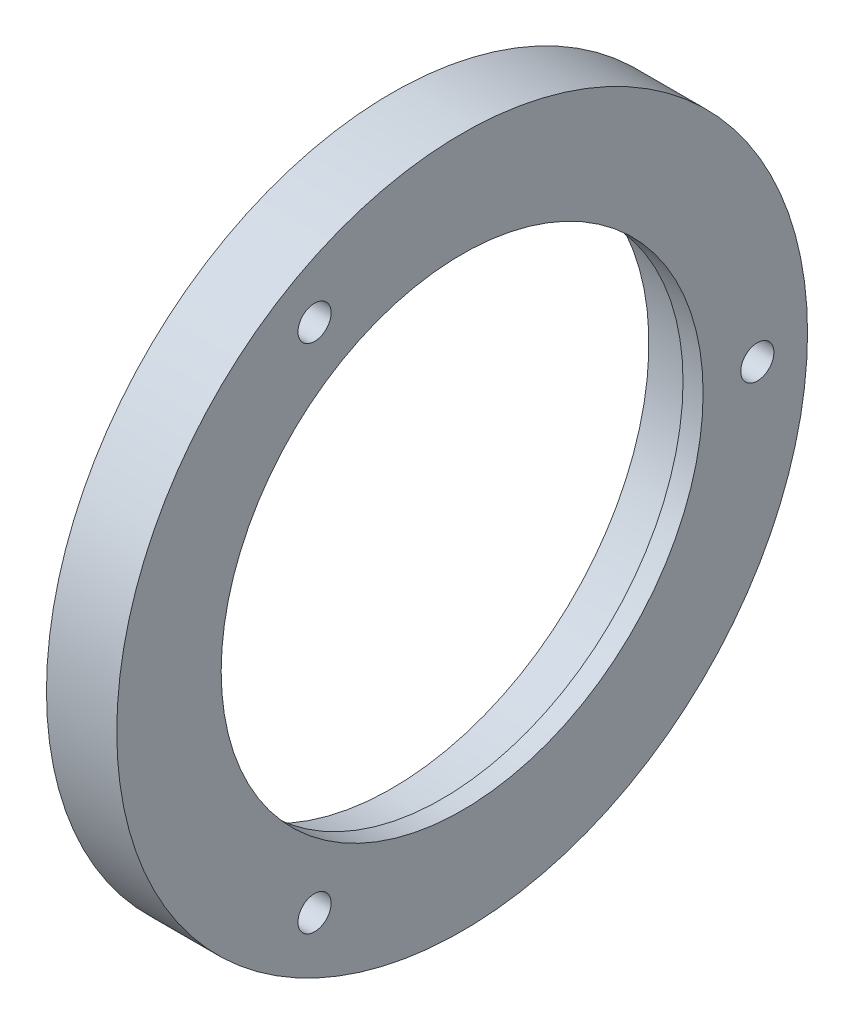
ISO-10303-21;
HEADER;
FILE_DESCRIPTION(('STEP AP214'),'2;1');
FILE_NAME('part.step','',(''),(''),'','','');
FILE_SCHEMA(('AUTOMOTIVE_DESIGN { 1 0 10303 214 1 1 1 1 }'));
ENDSEC;
DATA;
#1=APPLICATION_CONTEXT('core data for automotive mechanical design processes');
#2=APPLICATION_PROTOCOL_DEFINITION('international standard','automotive_design',2000,#1);
#3=PRODUCT_CONTEXT('',#1,'mechanical');
#4=PRODUCT('Part','Part','',(#3));
#5=PRODUCT_RELATED_PRODUCT_CATEGORY('part','',(#4));
#6=PRODUCT_DEFINITION_FORMATION('','',#4);
#7=PRODUCT_DEFINITION_CONTEXT('part definition',#1,'design');
#8=PRODUCT_DEFINITION('design','',#6,#7);
#9=PRODUCT_DEFINITION_SHAPE('','',#8);
#10=(LENGTH_UNIT() NAMED_UNIT(*) SI_UNIT(.MILLI.,.METRE.));
#11=(NAMED_UNIT(*) PLANE_ANGLE_UNIT() SI_UNIT($,.RADIAN.));
#12=(NAMED_UNIT(*) SI_UNIT($,.STERADIAN.) SOLID_ANGLE_UNIT());
#13=UNCERTAINTY_MEASURE_WITH_UNIT(LENGTH_MEASURE(1.E-05),#10,'distance_accuracy_value','');
#14=(GEOMETRIC_REPRESENTATION_CONTEXT(3) GLOBAL_UNCERTAINTY_ASSIGNED_CONTEXT((#13)) GLOBAL_UNIT_ASSIGNED_CONTEXT((#10,
#11,#12)) REPRESENTATION_CONTEXT('',''));
#15=CARTESIAN_POINT('',(0.,0.,0.));
#16=DIRECTION('',(0.,0.,1.));
#17=DIRECTION('',(1.,0.,0.));
#18=AXIS2_PLACEMENT_3D('',#15,#16,#17);
#19=CARTESIAN_POINT('',(169.7,-25.4611468712625,14.7));
#20=DIRECTION('',(-1.,0.,0.));
#21=DIRECTION('',(0.,0.,1.));
#22=AXIS2_PLACEMENT_3D('',#19,#20,#21);
#23=CYLINDRICAL_SURFACE('',#22,1.65);
#24=CARTESIAN_POINT('',(169.7,-25.4611468712625,14.7));
#25=DIRECTION('',(1.,0.,0.));
#26=DIRECTION('',(0.,0.,-1.));
#27=AXIS2_PLACEMENT_3D('',#24,#25,#26);
#28=CIRCLE('',#27,1.65);
#29=CARTESIAN_POINT('',(169.7,-25.4611468712625,16.35));
#30=VERTEX_POINT('',#29);
#31=EDGE_CURVE('E78',#30,#30,#28,.F.);
#32=CARTESIAN_POINT('',(171.3,-25.4611468712625,14.7));
#33=DIRECTION('',(1.,0.,0.));
#34=DIRECTION('',(0.,0.,-1.));
#35=AXIS2_PLACEMENT_3D('',#32,#33,#34);
#36=CIRCLE('',#35,1.65);
#37=CARTESIAN_POINT('',(171.3,-25.4611468712625,16.35));
#38=VERTEX_POINT('',#37);
#39=EDGE_CURVE('E35',#38,#38,#36,.T.);
#40=CARTESIAN_POINT('',(169.7,-25.4611468712625,16.35));
#41=CARTESIAN_POINT('',(169.716666666667,-25.4611468712625,16.35));
#42=CARTESIAN_POINT('',(169.733333333333,-25.4611468712625,16.35));
#43=CARTESIAN_POINT('',(169.766666666667,-25.4611468712625,16.35));
#44=CARTESIAN_POINT('',(169.783333333333,-25.4611468712625,16.35));
#45=CARTESIAN_POINT('',(169.816666666667,-25.4611468712625,16.35));
#46=CARTESIAN_POINT('',(169.833333333333,-25.4611468712625,16.35));
#47=CARTESIAN_POINT('',(169.866666666667,-25.4611468712625,16.35));
#48=CARTESIAN_POINT('',(169.883333333333,-25.4611468712625,16.35));
#49=CARTESIAN_POINT('',(169.916666666667,-25.4611468712625,16.35));
#50=CARTESIAN_POINT('',(169.933333333333,-25.4611468712625,16.35));
#51=CARTESIAN_POINT('',(169.966666666667,-25.4611468712625,16.35));
#52=CARTESIAN_POINT('',(169.983333333333,-25.4611468712625,16.35));
#53=CARTESIAN_POINT('',(170.016666666667,-25.4611468712625,16.35));
#54=CARTESIAN_POINT('',(170.033333333333,-25.4611468712625,16.35));
#55=CARTESIAN_POINT('',(170.066666666667,-25.4611468712625,16.35));
#56=CARTESIAN_POINT('',(170.083333333333,-25.4611468712625,16.35));
#57=CARTESIAN_POINT('',(170.116666666667,-25.4611468712625,16.35));
#58=CARTESIAN_POINT('',(170.133333333333,-25.4611468712625,16.35));
#59=CARTESIAN_POINT('',(170.166666666667,-25.4611468712625,16.35));
#60=CARTESIAN_POINT('',(170.183333333333,-25.4611468712625,16.35));
#61=CARTESIAN_POINT('',(170.216666666667,-25.4611468712625,16.35));
#62=CARTESIAN_POINT('',(170.233333333333,-25.4611468712625,16.35));
#63=CARTESIAN_POINT('',(170.266666666667,-25.4611468712625,16.35));
#64=CARTESIAN_POINT('',(170.283333333333,-25.4611468712625,16.35));
#65=CARTESIAN_POINT('',(170.316666666667,-25.4611468712625,16.35));
#66=CARTESIAN_POINT('',(170.333333333333,-25.4611468712625,16.35));
#67=CARTESIAN_POINT('',(170.366666666667,-25.4611468712625,16.35));
#68=CARTESIAN_POINT('',(170.383333333333,-25.4611468712625,16.35));
#69=CARTESIAN_POINT('',(170.416666666667,-25.4611468712625,16.35));
#70=CARTESIAN_POINT('',(170.433333333333,-25.4611468712625,16.35));
#71=CARTESIAN_POINT('',(170.466666666667,-25.4611468712625,16.35));
#72=CARTESIAN_POINT('',(170.483333333333,-25.4611468712625,16.35));
#73=CARTESIAN_POINT('',(170.516666666667,-25.4611468712625,16.35));
#74=CARTESIAN_POINT('',(170.533333333333,-25.4611468712625,16.35));
#75=CARTESIAN_POINT('',(170.566666666667,-25.4611468712625,16.35));
#76=CARTESIAN_POINT('',(170.583333333333,-25.4611468712625,16.35));
#77=CARTESIAN_POINT('',(170.616666666667,-25.4611468712625,16.35));
#78=CARTESIAN_POINT('',(170.633333333333,-25.4611468712625,16.35));
#79=CARTESIAN_POINT('',(170.666666666667,-25.4611468712625,16.35));
#80=CARTESIAN_POINT('',(170.683333333333,-25.4611468712625,16.35));
#81=CARTESIAN_POINT('',(170.716666666667,-25.4611468712625,16.35));
#82=CARTESIAN_POINT('',(170.733333333333,-25.4611468712625,16.35));
#83=CARTESIAN_POINT('',(170.766666666667,-25.4611468712625,16.35));
#84=CARTESIAN_POINT('',(170.783333333333,-25.4611468712625,16.35));
#85=CARTESIAN_POINT('',(170.816666666667,-25.4611468712625,16.35));
#86=CARTESIAN_POINT('',(170.833333333333,-25.4611468712625,16.35));
#87=CARTESIAN_POINT('',(170.866666666667,-25.4611468712625,16.35));
#88=CARTESIAN_POINT('',(170.883333333333,-25.4611468712625,16.35));
#89=CARTESIAN_POINT('',(170.916666666667,-25.4611468712625,16.35));
#90=CARTESIAN_POINT('',(170.933333333333,-25.4611468712625,16.35));
#91=CARTESIAN_POINT('',(170.966666666667,-25.4611468712625,16.35));
#92=CARTESIAN_POINT('',(170.983333333333,-25.4611468712625,16.35));
#93=CARTESIAN_POINT('',(171.016666666667,-25.4611468712625,16.35));
#94=CARTESIAN_POINT('',(171.033333333333,-25.4611468712625,16.35));
#95=CARTESIAN_POINT('',(171.066666666667,-25.4611468712625,16.35));
#96=CARTESIAN_POINT('',(171.083333333333,-25.4611468712625,16.35));
#97=CARTESIAN_POINT('',(171.116666666667,-25.4611468712625,16.35));
#98=CARTESIAN_POINT('',(171.133333333333,-25.4611468712625,16.35));
#99=CARTESIAN_POINT('',(171.166666666667,-25.4611468712625,16.35));
#100=CARTESIAN_POINT('',(171.183333333333,-25.4611468712625,16.35));
#101=CARTESIAN_POINT('',(171.216666666667,-25.4611468712625,16.35));
#102=CARTESIAN_POINT('',(171.233333333333,-25.4611468712625,16.35));
#103=CARTESIAN_POINT('',(171.266666666667,-25.4611468712625,16.35));
#104=CARTESIAN_POINT('',(171.283333333333,-25.4611468712625,16.35));
#105=CARTESIAN_POINT('',(171.3,-25.4611468712625,16.35));
#106=B_SPLINE_CURVE_WITH_KNOTS('',3,(#40,#41,#42,#43,#44,#45,#46,#47,#48,#49,#50,#51,#52,#53,
#54,#55,#56,#57,#58,#59,#60,#61,#62,#63,#64,#65,#66,#67,#68,#69,#70,#71,#72,#73,#74,#75,#76,#77,
#78,#79,#80,#81,#82,#83,#84,#85,#86,#87,#88,#89,#90,#91,#92,#93,#94,#95,#96,#97,#98,#99,#100,
#101,#102,#103,#104,#105),.UNSPECIFIED.,.F.,.F.,(4,2,2,2,2,2,2,2,2,2,2,2,2,2,2,2,2,2,2,2,2,2,2,
2,2,2,2,2,2,2,2,2,4),(0.,0.0499999999999945,0.099999999999989,0.149999999999983,
0.199999999999978,0.25,0.299999999999995,0.349999999999989,0.399999999999984,0.449999999999978,
0.5,0.549999999999995,0.599999999999989,0.649999999999984,0.700000000000006,0.750000000000001,
0.799999999999995,0.84999999999999,0.899999999999984,0.950000000000006,1.,1.05,1.09999999999999,
1.15000000000001,1.20000000000001,1.25,1.3,1.34999999999999,1.40000000000001,1.45000000000001,
1.5,1.55,1.59999999999999),.UNSPECIFIED.);
#107=EDGE_CURVE('BSEAM31',#30,#38,#106,.T.);
#108=ORIENTED_EDGE('',*,*,#31,.T.);
#109=ORIENTED_EDGE('',*,*,#39,.T.);
#110=ORIENTED_EDGE('',*,*,#107,.T.);
#111=ORIENTED_EDGE('',*,*,#107,.F.);
#112=EDGE_LOOP('',(#108,#110,#109,#111));
#113=FACE_BOUND('',#112,.T.);
#114=ADVANCED_FACE('F31',(#113),#23,.F.);
#115=CARTESIAN_POINT('',(169.7,25.4611468712625,14.7));
#116=DIRECTION('',(-1.,0.,0.));
#117=DIRECTION('',(0.,0.,1.));
#118=AXIS2_PLACEMENT_3D('',#115,#116,#117);
#119=CYLINDRICAL_SURFACE('',#118,1.65);
#120=CARTESIAN_POINT('',(169.7,25.4611468712625,14.7));
#121=DIRECTION('',(1.,0.,0.));
#122=DIRECTION('',(0.,0.,-1.));
#123=AXIS2_PLACEMENT_3D('',#120,#121,#122);
#124=CIRCLE('',#123,1.65);
#125=CARTESIAN_POINT('',(169.7,25.4611468712625,16.35));
#126=VERTEX_POINT('',#125);
#127=EDGE_CURVE('E81',#126,#126,#124,.F.);
#128=CARTESIAN_POINT('',(171.3,25.4611468712625,14.7));
#129=DIRECTION('',(1.,0.,0.));
#130=DIRECTION('',(0.,0.,-1.));
#131=AXIS2_PLACEMENT_3D('',#128,#129,#130);
#132=CIRCLE('',#131,1.65);
#133=CARTESIAN_POINT('',(171.3,25.4611468712625,16.35));
#134=VERTEX_POINT('',#133);
#135=EDGE_CURVE('E58',#134,#134,#132,.T.);
#136=CARTESIAN_POINT('',(169.7,25.4611468712625,16.35));
#137=CARTESIAN_POINT('',(169.716666666667,25.4611468712625,16.35));
#138=CARTESIAN_POINT('',(169.733333333333,25.4611468712625,16.35));
#139=CARTESIAN_POINT('',(169.766666666667,25.4611468712625,16.35));
#140=CARTESIAN_POINT('',(169.783333333333,25.4611468712625,16.35));
#141=CARTESIAN_POINT('',(169.816666666667,25.4611468712625,16.35));
#142=CARTESIAN_POINT('',(169.833333333333,25.4611468712625,16.35));
#143=CARTESIAN_POINT('',(169.866666666667,25.4611468712625,16.35));
#144=CARTESIAN_POINT('',(169.883333333333,25.4611468712625,16.35));
#145=CARTESIAN_POINT('',(169.916666666667,25.4611468712625,16.35));
#146=CARTESIAN_POINT('',(169.933333333333,25.4611468712625,16.35));
#147=CARTESIAN_POINT('',(169.966666666667,25.4611468712625,16.35));
#148=CARTESIAN_POINT('',(169.983333333333,25.4611468712625,16.35));
#149=CARTESIAN_POINT('',(170.016666666667,25.4611468712625,16.35));
#150=CARTESIAN_POINT('',(170.033333333333,25.4611468712625,16.35));
#151=CARTESIAN_POINT('',(170.066666666667,25.4611468712625,16.35));
#152=CARTESIAN_POINT('',(170.083333333333,25.4611468712625,16.35));
#153=CARTESIAN_POINT('',(170.116666666667,25.4611468712625,16.35));
#154=CARTESIAN_POINT('',(170.133333333333,25.4611468712625,16.35));
#155=CARTESIAN_POINT('',(170.166666666667,25.4611468712625,16.35));
#156=CARTESIAN_POINT('',(170.183333333333,25.4611468712625,16.35));
#157=CARTESIAN_POINT('',(170.216666666667,25.4611468712625,16.35));
#158=CARTESIAN_POINT('',(170.233333333333,25.4611468712625,16.35));
#159=CARTESIAN_POINT('',(170.266666666667,25.4611468712625,16.35));
#160=CARTESIAN_POINT('',(170.283333333333,25.4611468712625,16.35));
#161=CARTESIAN_POINT('',(170.316666666667,25.4611468712625,16.35));
#162=CARTESIAN_POINT('',(170.333333333333,25.4611468712625,16.35));
#163=CARTESIAN_POINT('',(170.366666666667,25.4611468712625,16.35));
#164=CARTESIAN_POINT('',(170.383333333333,25.4611468712625,16.35));
#165=CARTESIAN_POINT('',(170.416666666667,25.4611468712625,16.35));
#166=CARTESIAN_POINT('',(170.433333333333,25.4611468712625,16.35));
#167=CARTESIAN_POINT('',(170.466666666667,25.4611468712625,16.35));
#168=CARTESIAN_POINT('',(170.483333333333,25.4611468712625,16.35));
#169=CARTESIAN_POINT('',(170.516666666667,25.4611468712625,16.35));
#170=CARTESIAN_POINT('',(170.533333333333,25.4611468712625,16.35));
#171=CARTESIAN_POINT('',(170.566666666667,25.4611468712625,16.35));
#172=CARTESIAN_POINT('',(170.583333333333,25.4611468712625,16.35));
#173=CARTESIAN_POINT('',(170.616666666667,25.4611468712625,16.35));
#174=CARTESIAN_POINT('',(170.633333333333,25.4611468712625,16.35));
#175=CARTESIAN_POINT('',(170.666666666667,25.4611468712625,16.35));
#176=CARTESIAN_POINT('',(170.683333333333,25.4611468712625,16.35));
#177=CARTESIAN_POINT('',(170.716666666667,25.4611468712625,16.35));
#178=CARTESIAN_POINT('',(170.733333333333,25.4611468712625,16.35));
#179=CARTESIAN_POINT('',(170.766666666667,25.4611468712625,16.35));
#180=CARTESIAN_POINT('',(170.783333333333,25.4611468712625,16.35));
#181=CARTESIAN_POINT('',(170.816666666667,25.4611468712625,16.35));
#182=CARTESIAN_POINT('',(170.833333333333,25.4611468712625,16.35));
#183=CARTESIAN_POINT('',(170.866666666667,25.4611468712625,16.35));
#184=CARTESIAN_POINT('',(170.883333333333,25.4611468712625,16.35));
#185=CARTESIAN_POINT('',(170.916666666667,25.4611468712625,16.35));
#186=CARTESIAN_POINT('',(170.933333333333,25.4611468712625,16.35));
#187=CARTESIAN_POINT('',(170.966666666667,25.4611468712625,16.35));
#188=CARTESIAN_POINT('',(170.983333333333,25.4611468712625,16.35));
#189=CARTESIAN_POINT('',(171.016666666667,25.4611468712625,16.35));
#190=CARTESIAN_POINT('',(171.033333333333,25.4611468712625,16.35));
#191=CARTESIAN_POINT('',(171.066666666667,25.4611468712625,16.35));
#192=CARTESIAN_POINT('',(171.083333333333,25.4611468712625,16.35));
#193=CARTESIAN_POINT('',(171.116666666667,25.4611468712625,16.35));
#194=CARTESIAN_POINT('',(171.133333333333,25.4611468712625,16.35));
#195=CARTESIAN_POINT('',(171.166666666667,25.4611468712625,16.35));
#196=CARTESIAN_POINT('',(171.183333333333,25.4611468712625,16.35));
#197=CARTESIAN_POINT('',(171.216666666667,25.4611468712625,16.35));
#198=CARTESIAN_POINT('',(171.233333333333,25.4611468712625,16.35));
#199=CARTESIAN_POINT('',(171.266666666667,25.4611468712625,16.35));
#200=CARTESIAN_POINT('',(171.283333333333,25.4611468712625,16.35));
#201=CARTESIAN_POINT('',(171.3,25.4611468712625,16.35));
#202=B_SPLINE_CURVE_WITH_KNOTS('',3,(#136,#137,#138,#139,#140,#141,#142,#143,#144,#145,#146,
#147,#148,#149,#150,#151,#152,#153,#154,#155,#156,#157,#158,#159,#160,#161,#162,#163,#164,#165,
#166,#167,#168,#169,#170,#171,#172,#173,#174,#175,#176,#177,#178,#179,#180,#181,#182,#183,#184,
#185,#186,#187,#188,#189,#190,#191,#192,#193,#194,#195,#196,#197,#198,#199,#200,#201),
.UNSPECIFIED.,.F.,.F.,(4,2,2,2,2,2,2,2,2,2,2,2,2,2,2,2,2,2,2,2,2,2,2,2,2,2,2,2,2,2,2,2,4),(0.,
0.0499999999999945,0.099999999999989,0.149999999999983,0.199999999999978,0.25,0.299999999999995,
0.349999999999989,0.399999999999984,0.449999999999978,0.5,0.549999999999995,0.599999999999989,
0.649999999999984,0.700000000000006,0.750000000000001,0.799999999999995,0.84999999999999,
0.899999999999984,0.950000000000006,1.,1.05,1.09999999999999,1.15000000000001,1.20000000000001,
1.25,1.3,1.34999999999999,1.40000000000001,1.45000000000001,1.5,1.55,1.59999999999999),.UNSPECIFIED.);
#203=EDGE_CURVE('BSEAM114',#126,#134,#202,.T.);
#204=ORIENTED_EDGE('',*,*,#127,.T.);
#205=ORIENTED_EDGE('',*,*,#135,.T.);
#206=ORIENTED_EDGE('',*,*,#203,.T.);
#207=ORIENTED_EDGE('',*,*,#203,.F.);
#208=EDGE_LOOP('',(#204,#206,#205,#207));
#209=FACE_BOUND('',#208,.T.);
#210=ADVANCED_FACE('F114',(#209),#119,.F.);
#211=CARTESIAN_POINT('',(169.7,0.,-29.4));
#212=DIRECTION('',(-1.,0.,0.));
#213=DIRECTION('',(0.,0.,1.));
#214=AXIS2_PLACEMENT_3D('',#211,#212,#213);
#215=CYLINDRICAL_SURFACE('',#214,1.65);
#216=CARTESIAN_POINT('',(169.7,0.,-29.4));
#217=DIRECTION('',(1.,0.,0.));
#218=DIRECTION('',(0.,0.,-1.));
#219=AXIS2_PLACEMENT_3D('',#216,#217,#218);
#220=CIRCLE('',#219,1.65);
#221=CARTESIAN_POINT('',(169.7,0.,-27.75));
#222=VERTEX_POINT('',#221);
#223=EDGE_CURVE('E84',#222,#222,#220,.F.);
#224=CARTESIAN_POINT('',(171.3,0.,-29.4));
#225=DIRECTION('',(1.,0.,0.));
#226=DIRECTION('',(0.,0.,-1.));
#227=AXIS2_PLACEMENT_3D('',#224,#225,#226);
#228=CIRCLE('',#227,1.65);
#229=CARTESIAN_POINT('',(171.3,0.,-27.75));
#230=VERTEX_POINT('',#229);
#231=EDGE_CURVE('E51',#230,#230,#228,.T.);
#232=CARTESIAN_POINT('',(169.7,0.,-27.75));
#233=CARTESIAN_POINT('',(169.716666666667,0.,-27.75));
#234=CARTESIAN_POINT('',(169.733333333333,0.,-27.75));
#235=CARTESIAN_POINT('',(169.766666666667,0.,-27.75));
#236=CARTESIAN_POINT('',(169.783333333333,0.,-27.75));
#237=CARTESIAN_POINT('',(169.816666666667,0.,-27.75));
#238=CARTESIAN_POINT('',(169.833333333333,0.,-27.75));
#239=CARTESIAN_POINT('',(169.866666666667,0.,-27.75));
#240=CARTESIAN_POINT('',(169.883333333333,0.,-27.75));
#241=CARTESIAN_POINT('',(169.916666666667,0.,-27.75));
#242=CARTESIAN_POINT('',(169.933333333333,0.,-27.75));
#243=CARTESIAN_POINT('',(169.966666666667,0.,-27.75));
#244=CARTESIAN_POINT('',(169.983333333333,0.,-27.75));
#245=CARTESIAN_POINT('',(170.016666666667,0.,-27.75));
#246=CARTESIAN_POINT('',(170.033333333333,0.,-27.75));
#247=CARTESIAN_POINT('',(170.066666666667,0.,-27.75));
#248=CARTESIAN_POINT('',(170.083333333333,0.,-27.75));
#249=CARTESIAN_POINT('',(170.116666666667,0.,-27.75));
#250=CARTESIAN_POINT('',(170.133333333333,0.,-27.75));
#251=CARTESIAN_POINT('',(170.166666666667,0.,-27.75));
#252=CARTESIAN_POINT('',(170.183333333333,0.,-27.75));
#253=CARTESIAN_POINT('',(170.216666666667,0.,-27.75));
#254=CARTESIAN_POINT('',(170.233333333333,0.,-27.75));
#255=CARTESIAN_POINT('',(170.266666666667,0.,-27.75));
#256=CARTESIAN_POINT('',(170.283333333333,0.,-27.75));
#257=CARTESIAN_POINT('',(170.316666666667,0.,-27.75));
#258=CARTESIAN_POINT('',(170.333333333333,0.,-27.75));
#259=CARTESIAN_POINT('',(170.366666666667,0.,-27.75));
#260=CARTESIAN_POINT('',(170.383333333333,0.,-27.75));
#261=CARTESIAN_POINT('',(170.416666666667,0.,-27.75));
#262=CARTESIAN_POINT('',(170.433333333333,0.,-27.75));
#263=CARTESIAN_POINT('',(170.466666666667,0.,-27.75));
#264=CARTESIAN_POINT('',(170.483333333333,0.,-27.75));
#265=CARTESIAN_POINT('',(170.516666666667,0.,-27.75));
#266=CARTESIAN_POINT('',(170.533333333333,0.,-27.75));
#267=CARTESIAN_POINT('',(170.566666666667,0.,-27.75));
#268=CARTESIAN_POINT('',(170.583333333333,0.,-27.75));
#269=CARTESIAN_POINT('',(170.616666666667,0.,-27.75));
#270=CARTESIAN_POINT('',(170.633333333333,0.,-27.75));
#271=CARTESIAN_POINT('',(170.666666666667,0.,-27.75));
#272=CARTESIAN_POINT('',(170.683333333333,0.,-27.75));
#273=CARTESIAN_POINT('',(170.716666666667,0.,-27.75));
#274=CARTESIAN_POINT('',(170.733333333333,0.,-27.75));
#275=CARTESIAN_POINT('',(170.766666666667,0.,-27.75));
#276=CARTESIAN_POINT('',(170.783333333333,0.,-27.75));
#277=CARTESIAN_POINT('',(170.816666666667,0.,-27.75));
#278=CARTESIAN_POINT('',(170.833333333333,0.,-27.75));
#279=CARTESIAN_POINT('',(170.866666666667,0.,-27.75));
#280=CARTESIAN_POINT('',(170.883333333333,0.,-27.75));
#281=CARTESIAN_POINT('',(170.916666666667,0.,-27.75));
#282=CARTESIAN_POINT('',(170.933333333333,0.,-27.75));
#283=CARTESIAN_POINT('',(170.966666666667,0.,-27.75));
#284=CARTESIAN_POINT('',(170.983333333333,0.,-27.75));
#285=CARTESIAN_POINT('',(171.016666666667,0.,-27.75));
#286=CARTESIAN_POINT('',(171.033333333333,0.,-27.75));
#287=CARTESIAN_POINT('',(171.066666666667,0.,-27.75));
#288=CARTESIAN_POINT('',(171.083333333333,0.,-27.75));
#289=CARTESIAN_POINT('',(171.116666666667,0.,-27.75));
#290=CARTESIAN_POINT('',(171.133333333333,0.,-27.75));
#291=CARTESIAN_POINT('',(171.166666666667,0.,-27.75));
#292=CARTESIAN_POINT('',(171.183333333333,0.,-27.75));
#293=CARTESIAN_POINT('',(171.216666666667,0.,-27.75));
#294=CARTESIAN_POINT('',(171.233333333333,0.,-27.75));
#295=CARTESIAN_POINT('',(171.266666666667,0.,-27.75));
#296=CARTESIAN_POINT('',(171.283333333333,0.,-27.75));
#297=CARTESIAN_POINT('',(171.3,0.,-27.75));
#298=B_SPLINE_CURVE_WITH_KNOTS('',3,(#232,#233,#234,#235,#236,#237,#238,#239,#240,#241,#242,
#243,#244,#245,#246,#247,#248,#249,#250,#251,#252,#253,#254,#255,#256,#257,#258,#259,#260,#261,
#262,#263,#264,#265,#266,#267,#268,#269,#270,#271,#272,#273,#274,#275,#276,#277,#278,#279,#280,
#281,#282,#283,#284,#285,#286,#287,#288,#289,#290,#291,#292,#293,#294,#295,#296,#297),
.UNSPECIFIED.,.F.,.F.,(4,2,2,2,2,2,2,2,2,2,2,2,2,2,2,2,2,2,2,2,2,2,2,2,2,2,2,2,2,2,2,2,4),(0.,
0.0499999999999945,0.099999999999989,0.149999999999983,0.199999999999978,0.25,0.299999999999995,
0.349999999999989,0.399999999999984,0.449999999999978,0.5,0.549999999999995,0.599999999999989,
0.649999999999984,0.700000000000006,0.750000000000001,0.799999999999995,0.84999999999999,
0.899999999999984,0.950000000000006,1.,1.05,1.09999999999999,1.15000000000001,1.20000000000001,
1.25,1.3,1.34999999999999,1.40000000000001,1.45000000000001,1.5,1.55,1.59999999999999),.UNSPECIFIED.);
#299=EDGE_CURVE('BSEAM111',#222,#230,#298,.T.);
#300=ORIENTED_EDGE('',*,*,#223,.T.);
#301=ORIENTED_EDGE('',*,*,#231,.T.);
#302=ORIENTED_EDGE('',*,*,#299,.T.);
#303=ORIENTED_EDGE('',*,*,#299,.F.);
#304=EDGE_LOOP('',(#300,#302,#301,#303));
#305=FACE_BOUND('',#304,.T.);
#306=ADVANCED_FACE('F111',(#305),#215,.F.);
#307=CARTESIAN_POINT('',(169.7,34.4,0.));
#308=DIRECTION('',(1.,0.,0.));
#309=DIRECTION('',(0.,0.,-1.));
#310=AXIS2_PLACEMENT_3D('',#307,#308,#309);
#311=PLANE('',#310);
#312=ORIENTED_EDGE('',*,*,#223,.F.);
#313=EDGE_LOOP('',(#312));
#314=FACE_BOUND('',#313,.T.);
#315=ORIENTED_EDGE('',*,*,#127,.F.);
#316=EDGE_LOOP('',(#315));
#317=FACE_BOUND('',#316,.T.);
#318=ORIENTED_EDGE('',*,*,#31,.F.);
#319=EDGE_LOOP('',(#318));
#320=FACE_BOUND('',#319,.T.);
#321=CARTESIAN_POINT('',(169.7,0.,0.));
#322=DIRECTION('',(-1.,0.,0.));
#323=DIRECTION('',(0.,0.,1.));
#324=AXIS2_PLACEMENT_3D('',#321,#322,#323);
#325=CIRCLE('',#324,25.6);
#326=CARTESIAN_POINT('',(169.7,0.,25.6));
#327=VERTEX_POINT('',#326);
#328=EDGE_CURVE('E10',#327,#327,#325,.T.);
#329=ORIENTED_EDGE('',*,*,#328,.F.);
#330=EDGE_LOOP('',(#329));
#331=FACE_BOUND('',#330,.T.);
#332=CARTESIAN_POINT('',(169.7,0.,0.));
#333=DIRECTION('',(-1.,0.,0.));
#334=DIRECTION('',(0.,0.,1.));
#335=AXIS2_PLACEMENT_3D('',#332,#333,#334);
#336=CIRCLE('',#335,34.4);
#337=CARTESIAN_POINT('',(169.7,0.,34.4));
#338=VERTEX_POINT('',#337);
#339=EDGE_CURVE('E87',#338,#338,#336,.T.);
#340=ORIENTED_EDGE('',*,*,#339,.T.);
#341=EDGE_LOOP('',(#340));
#342=FACE_BOUND('',#341,.T.);
#343=ADVANCED_FACE('F33',(#314,#317,#320,#331,#342),#311,.F.);
#344=CARTESIAN_POINT('',(-110.,0.,0.));
#345=DIRECTION('',(-1.,0.,0.));
#346=DIRECTION('',(0.,0.,1.));
#347=AXIS2_PLACEMENT_3D('',#344,#345,#346);
#348=CYLINDRICAL_SURFACE('',#347,25.6);
#349=CARTESIAN_POINT('',(174.7,0.,0.));
#350=DIRECTION('',(-1.,0.,0.));
#351=DIRECTION('',(0.,0.,1.));
#352=AXIS2_PLACEMENT_3D('',#349,#350,#351);
#353=CIRCLE('',#352,25.6);
#354=CARTESIAN_POINT('',(174.7,0.,25.6));
#355=VERTEX_POINT('',#354);
#356=EDGE_CURVE('E39',#355,#355,#353,.T.);
#357=ORIENTED_EDGE('',*,*,#356,.F.);
#358=EDGE_LOOP('',(#357));
#359=FACE_BOUND('',#358,.T.);
#360=ORIENTED_EDGE('',*,*,#328,.T.);
#361=EDGE_LOOP('',(#360));
#362=FACE_BOUND('',#361,.T.);
#363=ADVANCED_FACE('F103',(#359,#362),#348,.F.);
#364=CARTESIAN_POINT('',(174.7,25.6,0.));
#365=DIRECTION('',(1.,0.,0.));
#366=DIRECTION('',(0.,0.,-1.));
#367=AXIS2_PLACEMENT_3D('',#364,#365,#366);
#368=PLANE('',#367);
#369=CARTESIAN_POINT('',(174.7,0.,0.));
#370=DIRECTION('',(-1.,0.,0.));
#371=DIRECTION('',(0.,0.,1.));
#372=AXIS2_PLACEMENT_3D('',#369,#370,#371);
#373=CIRCLE('',#372,24.);
#374=CARTESIAN_POINT('',(174.7,0.,24.));
#375=VERTEX_POINT('',#374);
#376=EDGE_CURVE('E44',#375,#375,#373,.T.);
#377=ORIENTED_EDGE('',*,*,#376,.F.);
#378=EDGE_LOOP('',(#377));
#379=FACE_BOUND('',#378,.T.);
#380=ORIENTED_EDGE('',*,*,#356,.T.);
#381=EDGE_LOOP('',(#380));
#382=FACE_BOUND('',#381,.T.);
#383=ADVANCED_FACE('F100',(#379,#382),#368,.F.);
#384=CARTESIAN_POINT('',(-110.,0.,0.));
#385=DIRECTION('',(-1.,0.,0.));
#386=DIRECTION('',(0.,0.,1.));
#387=AXIS2_PLACEMENT_3D('',#384,#385,#386);
#388=CYLINDRICAL_SURFACE('',#387,24.);
#389=CARTESIAN_POINT('',(176.7,0.,0.));
#390=DIRECTION('',(-1.,0.,0.));
#391=DIRECTION('',(0.,0.,1.));
#392=AXIS2_PLACEMENT_3D('',#389,#390,#391);
#393=CIRCLE('',#392,24.);
#394=CARTESIAN_POINT('',(176.7,0.,24.));
#395=VERTEX_POINT('',#394);
#396=EDGE_CURVE('E93',#395,#395,#393,.T.);
#397=ORIENTED_EDGE('',*,*,#396,.F.);
#398=EDGE_LOOP('',(#397));
#399=FACE_BOUND('',#398,.T.);
#400=ORIENTED_EDGE('',*,*,#376,.T.);
#401=EDGE_LOOP('',(#400));
#402=FACE_BOUND('',#401,.T.);
#403=ADVANCED_FACE('F98',(#399,#402),#388,.F.);
#404=CARTESIAN_POINT('',(176.7,24.,0.));
#405=DIRECTION('',(-1.,0.,0.));
#406=DIRECTION('',(0.,0.,1.));
#407=AXIS2_PLACEMENT_3D('',#404,#405,#406);
#408=PLANE('',#407);
#409=CARTESIAN_POINT('',(176.7,0.,-29.4));
#410=DIRECTION('',(1.,0.,0.));
#411=DIRECTION('',(0.,0.,-1.));
#412=AXIS2_PLACEMENT_3D('',#409,#410,#411);
#413=CIRCLE('',#412,1.65);
#414=CARTESIAN_POINT('',(176.7,0.,-27.75));
#415=VERTEX_POINT('',#414);
#416=EDGE_CURVE('E74',#415,#415,#413,.T.);
#417=ORIENTED_EDGE('',*,*,#416,.F.);
#418=EDGE_LOOP('',(#417));
#419=FACE_BOUND('',#418,.T.);
#420=CARTESIAN_POINT('',(176.7,25.4611468712625,14.7));
#421=DIRECTION('',(1.,0.,0.));
#422=DIRECTION('',(0.,0.,-1.));
#423=AXIS2_PLACEMENT_3D('',#420,#421,#422);
#424=CIRCLE('',#423,1.65);
#425=CARTESIAN_POINT('',(176.7,25.4611468712625,16.35));
#426=VERTEX_POINT('',#425);
#427=EDGE_CURVE('E69',#426,#426,#424,.T.);
#428=ORIENTED_EDGE('',*,*,#427,.F.);
#429=EDGE_LOOP('',(#428));
#430=FACE_BOUND('',#429,.T.);
#431=CARTESIAN_POINT('',(176.7,-25.4611468712625,14.7));
#432=DIRECTION('',(1.,0.,0.));
#433=DIRECTION('',(0.,0.,-1.));
#434=AXIS2_PLACEMENT_3D('',#431,#432,#433);
#435=CIRCLE('',#434,1.65);
#436=CARTESIAN_POINT('',(176.7,-25.4611468712625,16.35));
#437=VERTEX_POINT('',#436);
#438=EDGE_CURVE('E65',#437,#437,#435,.T.);
#439=ORIENTED_EDGE('',*,*,#438,.F.);
#440=EDGE_LOOP('',(#439));
#441=FACE_BOUND('',#440,.T.);
#442=CARTESIAN_POINT('',(176.7,0.,0.));
#443=DIRECTION('',(-1.,0.,0.));
#444=DIRECTION('',(0.,0.,1.));
#445=AXIS2_PLACEMENT_3D('',#442,#443,#444);
#446=CIRCLE('',#445,34.4);
#447=CARTESIAN_POINT('',(176.7,0.,34.4));
#448=VERTEX_POINT('',#447);
#449=EDGE_CURVE('E90',#448,#448,#446,.T.);
#450=ORIENTED_EDGE('',*,*,#449,.F.);
#451=EDGE_LOOP('',(#450));
#452=FACE_BOUND('',#451,.T.);
#453=ORIENTED_EDGE('',*,*,#396,.T.);
#454=EDGE_LOOP('',(#453));
#455=FACE_BOUND('',#454,.T.);
#456=ADVANCED_FACE('F134',(#419,#430,#441,#452,#455),#408,.F.);
#457=CARTESIAN_POINT('',(-110.,0.,0.));
#458=DIRECTION('',(-1.,0.,0.));
#459=DIRECTION('',(0.,0.,1.));
#460=AXIS2_PLACEMENT_3D('',#457,#458,#459);
#461=CYLINDRICAL_SURFACE('',#460,34.4);
#462=ORIENTED_EDGE('',*,*,#339,.F.);
#463=EDGE_LOOP('',(#462));
#464=FACE_BOUND('',#463,.T.);
#465=ORIENTED_EDGE('',*,*,#449,.T.);
#466=EDGE_LOOP('',(#465));
#467=FACE_BOUND('',#466,.T.);
#468=ADVANCED_FACE('F126',(#464,#467),#461,.T.);
#469=CARTESIAN_POINT('',(174.,-25.4611468712625,14.7));
#470=DIRECTION('',(1.,0.,0.));
#471=DIRECTION('',(0.,0.,-1.));
#472=AXIS2_PLACEMENT_3D('',#469,#470,#471);
#473=CIRCLE('',#472,1.65);
#474=CARTESIAN_POINT('',(174.,-25.4611468712625,16.35));
#475=VERTEX_POINT('',#474);
#476=EDGE_CURVE('E60',#475,#475,#473,.T.);
#477=CARTESIAN_POINT('',(174.,-25.4611468712625,16.35));
#478=CARTESIAN_POINT('',(174.028125,-25.4611468712625,16.35));
#479=CARTESIAN_POINT('',(174.05625,-25.4611468712625,16.35));
#480=CARTESIAN_POINT('',(174.1125,-25.4611468712625,16.35));
#481=CARTESIAN_POINT('',(174.140625,-25.4611468712625,16.35));
#482=CARTESIAN_POINT('',(174.196875,-25.4611468712625,16.35));
#483=CARTESIAN_POINT('',(174.225,-25.4611468712625,16.35));
#484=CARTESIAN_POINT('',(174.28125,-25.4611468712625,16.35));
#485=CARTESIAN_POINT('',(174.309375,-25.4611468712625,16.35));
#486=CARTESIAN_POINT('',(174.365625,-25.4611468712625,16.35));
#487=CARTESIAN_POINT('',(174.39375,-25.4611468712625,16.35));
#488=CARTESIAN_POINT('',(174.45,-25.4611468712625,16.35));
#489=CARTESIAN_POINT('',(174.478125,-25.4611468712625,16.35));
#490=CARTESIAN_POINT('',(174.534375,-25.4611468712625,16.35));
#491=CARTESIAN_POINT('',(174.5625,-25.4611468712625,16.35));
#492=CARTESIAN_POINT('',(174.61875,-25.4611468712625,16.35));
#493=CARTESIAN_POINT('',(174.646875,-25.4611468712625,16.35));
#494=CARTESIAN_POINT('',(174.703125,-25.4611468712625,16.35));
#495=CARTESIAN_POINT('',(174.73125,-25.4611468712625,16.35));
#496=CARTESIAN_POINT('',(174.7875,-25.4611468712625,16.35));
#497=CARTESIAN_POINT('',(174.815625,-25.4611468712625,16.35));
#498=CARTESIAN_POINT('',(174.871875,-25.4611468712625,16.35));
#499=CARTESIAN_POINT('',(174.9,-25.4611468712625,16.35));
#500=CARTESIAN_POINT('',(174.95625,-25.4611468712625,16.35));
#501=CARTESIAN_POINT('',(174.984375,-25.4611468712625,16.35));
#502=CARTESIAN_POINT('',(175.040625,-25.4611468712625,16.35));
#503=CARTESIAN_POINT('',(175.06875,-25.4611468712625,16.35));
#504=CARTESIAN_POINT('',(175.125,-25.4611468712625,16.35));
#505=CARTESIAN_POINT('',(175.153125,-25.4611468712625,16.35));
#506=CARTESIAN_POINT('',(175.209375,-25.4611468712625,16.35));
#507=CARTESIAN_POINT('',(175.2375,-25.4611468712625,16.35));
#508=CARTESIAN_POINT('',(175.29375,-25.4611468712625,16.35));
#509=CARTESIAN_POINT('',(175.321875,-25.4611468712625,16.35));
#510=CARTESIAN_POINT('',(175.378125,-25.4611468712625,16.35));
#511=CARTESIAN_POINT('',(175.40625,-25.4611468712625,16.35));
#512=CARTESIAN_POINT('',(175.4625,-25.4611468712625,16.35));
#513=CARTESIAN_POINT('',(175.490625,-25.4611468712625,16.35));
#514=CARTESIAN_POINT('',(175.546875,-25.4611468712625,16.35));
#515=CARTESIAN_POINT('',(175.575,-25.4611468712625,16.35));
#516=CARTESIAN_POINT('',(175.63125,-25.4611468712625,16.35));
#517=CARTESIAN_POINT('',(175.659375,-25.4611468712625,16.35));
#518=CARTESIAN_POINT('',(175.715625,-25.4611468712625,16.35));
#519=CARTESIAN_POINT('',(175.74375,-25.4611468712625,16.35));
#520=CARTESIAN_POINT('',(175.8,-25.4611468712625,16.35));
#521=CARTESIAN_POINT('',(175.828125,-25.4611468712625,16.35));
#522=CARTESIAN_POINT('',(175.884375,-25.4611468712625,16.35));
#523=CARTESIAN_POINT('',(175.9125,-25.4611468712625,16.35));
#524=CARTESIAN_POINT('',(175.96875,-25.4611468712625,16.35));
#525=CARTESIAN_POINT('',(175.996875,-25.4611468712625,16.35));
#526=CARTESIAN_POINT('',(176.053125,-25.4611468712625,16.35));
#527=CARTESIAN_POINT('',(176.08125,-25.4611468712625,16.35));
#528=CARTESIAN_POINT('',(176.1375,-25.4611468712625,16.35));
#529=CARTESIAN_POINT('',(176.165625,-25.4611468712625,16.35));
#530=CARTESIAN_POINT('',(176.221875,-25.4611468712625,16.35));
#531=CARTESIAN_POINT('',(176.25,-25.4611468712625,16.35));
#532=CARTESIAN_POINT('',(176.30625,-25.4611468712625,16.35));
#533=CARTESIAN_POINT('',(176.334375,-25.4611468712625,16.35));
#534=CARTESIAN_POINT('',(176.390625,-25.4611468712625,16.35));
#535=CARTESIAN_POINT('',(176.41875,-25.4611468712625,16.35));
#536=CARTESIAN_POINT('',(176.475,-25.4611468712625,16.35));
#537=CARTESIAN_POINT('',(176.503125,-25.4611468712625,16.35));
#538=CARTESIAN_POINT('',(176.559375,-25.4611468712625,16.35));
#539=CARTESIAN_POINT('',(176.5875,-25.4611468712625,16.35));
#540=CARTESIAN_POINT('',(176.64375,-25.4611468712625,16.35));
#541=CARTESIAN_POINT('',(176.671875,-25.4611468712625,16.35));
#542=CARTESIAN_POINT('',(176.7,-25.4611468712625,16.35));
#543=B_SPLINE_CURVE_WITH_KNOTS('',3,(#477,#478,#479,#480,#481,#482,#483,#484,#485,#486,#487,
#488,#489,#490,#491,#492,#493,#494,#495,#496,#497,#498,#499,#500,#501,#502,#503,#504,#505,#506,
#507,#508,#509,#510,#511,#512,#513,#514,#515,#516,#517,#518,#519,#520,#521,#522,#523,#524,#525,
#526,#527,#528,#529,#530,#531,#532,#533,#534,#535,#536,#537,#538,#539,#540,#541,#542),
.UNSPECIFIED.,.F.,.F.,(4,2,2,2,2,2,2,2,2,2,2,2,2,2,2,2,2,2,2,2,2,2,2,2,2,2,2,2,2,2,2,2,4),(0.,
0.0843750000000254,0.168750000000023,0.253125000000021,0.337500000000018,0.421875000000016,
0.506250000000014,0.590625000000011,0.675000000000009,0.759375000000034,0.843750000000032,
0.92812500000003,1.01250000000003,1.09687500000002,1.18125000000002,1.26562500000002,
1.35000000000002,1.43437500000004,1.51875000000004,1.60312500000004,1.68750000000004,
1.77187500000003,1.85625000000003,1.94062500000003,2.02500000000003,2.10937500000005,
2.19375000000005,2.27812500000005,2.36250000000005,2.44687500000004,2.53125000000004,
2.61562500000004,2.70000000000004),.UNSPECIFIED.);
#544=EDGE_CURVE('BSEAM117',#475,#437,#543,.T.);
#545=ORIENTED_EDGE('',*,*,#476,.F.);
#546=ORIENTED_EDGE('',*,*,#438,.T.);
#547=ORIENTED_EDGE('',*,*,#544,.T.);
#548=ORIENTED_EDGE('',*,*,#544,.F.);
#549=EDGE_LOOP('',(#545,#547,#546,#548));
#550=FACE_BOUND('',#549,.T.);
#551=ADVANCED_FACE('F117',(#550),#23,.F.);
#552=CARTESIAN_POINT('',(174.,25.4611468712625,14.7));
#553=DIRECTION('',(1.,0.,0.));
#554=DIRECTION('',(0.,0.,-1.));
#555=AXIS2_PLACEMENT_3D('',#552,#553,#554);
#556=CIRCLE('',#555,1.65);
#557=CARTESIAN_POINT('',(174.,25.4611468712625,16.35));
#558=VERTEX_POINT('',#557);
#559=EDGE_CURVE('E55',#558,#558,#556,.T.);
#560=CARTESIAN_POINT('',(174.,25.4611468712625,16.35));
#561=CARTESIAN_POINT('',(174.028125,25.4611468712625,16.35));
#562=CARTESIAN_POINT('',(174.05625,25.4611468712625,16.35));
#563=CARTESIAN_POINT('',(174.1125,25.4611468712625,16.35));
#564=CARTESIAN_POINT('',(174.140625,25.4611468712625,16.35));
#565=CARTESIAN_POINT('',(174.196875,25.4611468712625,16.35));
#566=CARTESIAN_POINT('',(174.225,25.4611468712625,16.35));
#567=CARTESIAN_POINT('',(174.28125,25.4611468712625,16.35));
#568=CARTESIAN_POINT('',(174.309375,25.4611468712625,16.35));
#569=CARTESIAN_POINT('',(174.365625,25.4611468712625,16.35));
#570=CARTESIAN_POINT('',(174.39375,25.4611468712625,16.35));
#571=CARTESIAN_POINT('',(174.45,25.4611468712625,16.35));
#572=CARTESIAN_POINT('',(174.478125,25.4611468712625,16.35));
#573=CARTESIAN_POINT('',(174.534375,25.4611468712625,16.35));
#574=CARTESIAN_POINT('',(174.5625,25.4611468712625,16.35));
#575=CARTESIAN_POINT('',(174.61875,25.4611468712625,16.35));
#576=CARTESIAN_POINT('',(174.646875,25.4611468712625,16.35));
#577=CARTESIAN_POINT('',(174.703125,25.4611468712625,16.35));
#578=CARTESIAN_POINT('',(174.73125,25.4611468712625,16.35));
#579=CARTESIAN_POINT('',(174.7875,25.4611468712625,16.35));
#580=CARTESIAN_POINT('',(174.815625,25.4611468712625,16.35));
#581=CARTESIAN_POINT('',(174.871875,25.4611468712625,16.35));
#582=CARTESIAN_POINT('',(174.9,25.4611468712625,16.35));
#583=CARTESIAN_POINT('',(174.95625,25.4611468712625,16.35));
#584=CARTESIAN_POINT('',(174.984375,25.4611468712625,16.35));
#585=CARTESIAN_POINT('',(175.040625,25.4611468712625,16.35));
#586=CARTESIAN_POINT('',(175.06875,25.4611468712625,16.35));
#587=CARTESIAN_POINT('',(175.125,25.4611468712625,16.35));
#588=CARTESIAN_POINT('',(175.153125,25.4611468712625,16.35));
#589=CARTESIAN_POINT('',(175.209375,25.4611468712625,16.35));
#590=CARTESIAN_POINT('',(175.2375,25.4611468712625,16.35));
#591=CARTESIAN_POINT('',(175.29375,25.4611468712625,16.35));
#592=CARTESIAN_POINT('',(175.321875,25.4611468712625,16.35));
#593=CARTESIAN_POINT('',(175.378125,25.4611468712625,16.35));
#594=CARTESIAN_POINT('',(175.40625,25.4611468712625,16.35));
#595=CARTESIAN_POINT('',(175.4625,25.4611468712625,16.35));
#596=CARTESIAN_POINT('',(175.490625,25.4611468712625,16.35));
#597=CARTESIAN_POINT('',(175.546875,25.4611468712625,16.35));
#598=CARTESIAN_POINT('',(175.575,25.4611468712625,16.35));
#599=CARTESIAN_POINT('',(175.63125,25.4611468712625,16.35));
#600=CARTESIAN_POINT('',(175.659375,25.4611468712625,16.35));
#601=CARTESIAN_POINT('',(175.715625,25.4611468712625,16.35));
#602=CARTESIAN_POINT('',(175.74375,25.4611468712625,16.35));
#603=CARTESIAN_POINT('',(175.8,25.4611468712625,16.35));
#604=CARTESIAN_POINT('',(175.828125,25.4611468712625,16.35));
#605=CARTESIAN_POINT('',(175.884375,25.4611468712625,16.35));
#606=CARTESIAN_POINT('',(175.9125,25.4611468712625,16.35));
#607=CARTESIAN_POINT('',(175.96875,25.4611468712625,16.35));
#608=CARTESIAN_POINT('',(175.996875,25.4611468712625,16.35));
#609=CARTESIAN_POINT('',(176.053125,25.4611468712625,16.35));
#610=CARTESIAN_POINT('',(176.08125,25.4611468712625,16.35));
#611=CARTESIAN_POINT('',(176.1375,25.4611468712625,16.35));
#612=CARTESIAN_POINT('',(176.165625,25.4611468712625,16.35));
#613=CARTESIAN_POINT('',(176.221875,25.4611468712625,16.35));
#614=CARTESIAN_POINT('',(176.25,25.4611468712625,16.35));
#615=CARTESIAN_POINT('',(176.30625,25.4611468712625,16.35));
#616=CARTESIAN_POINT('',(176.334375,25.4611468712625,16.35));
#617=CARTESIAN_POINT('',(176.390625,25.4611468712625,16.35));
#618=CARTESIAN_POINT('',(176.41875,25.4611468712625,16.35));
#619=CARTESIAN_POINT('',(176.475,25.4611468712625,16.35));
#620=CARTESIAN_POINT('',(176.503125,25.4611468712625,16.35));
#621=CARTESIAN_POINT('',(176.559375,25.4611468712625,16.35));
#622=CARTESIAN_POINT('',(176.5875,25.4611468712625,16.35));
#623=CARTESIAN_POINT('',(176.64375,25.4611468712625,16.35));
#624=CARTESIAN_POINT('',(176.671875,25.4611468712625,16.35));
#625=CARTESIAN_POINT('',(176.7,25.4611468712625,16.35));
#626=B_SPLINE_CURVE_WITH_KNOTS('',3,(#560,#561,#562,#563,#564,#565,#566,#567,#568,#569,#570,
#571,#572,#573,#574,#575,#576,#577,#578,#579,#580,#581,#582,#583,#584,#585,#586,#587,#588,#589,
#590,#591,#592,#593,#594,#595,#596,#597,#598,#599,#600,#601,#602,#603,#604,#605,#606,#607,#608,
#609,#610,#611,#612,#613,#614,#615,#616,#617,#618,#619,#620,#621,#622,#623,#624,#625),
.UNSPECIFIED.,.F.,.F.,(4,2,2,2,2,2,2,2,2,2,2,2,2,2,2,2,2,2,2,2,2,2,2,2,2,2,2,2,2,2,2,2,4),(0.,
0.0843750000000254,0.168750000000023,0.253125000000021,0.337500000000018,0.421875000000016,
0.506250000000014,0.590625000000011,0.675000000000009,0.759375000000034,0.843750000000032,
0.92812500000003,1.01250000000003,1.09687500000002,1.18125000000002,1.26562500000002,
1.35000000000002,1.43437500000004,1.51875000000004,1.60312500000004,1.68750000000004,
1.77187500000003,1.85625000000003,1.94062500000003,2.02500000000003,2.10937500000005,
2.19375000000005,2.27812500000005,2.36250000000005,2.44687500000004,2.53125000000004,
2.61562500000004,2.70000000000004),.UNSPECIFIED.);
#627=EDGE_CURVE('BSEAM123',#558,#426,#626,.T.);
#628=ORIENTED_EDGE('',*,*,#559,.F.);
#629=ORIENTED_EDGE('',*,*,#427,.T.);
#630=ORIENTED_EDGE('',*,*,#627,.T.);
#631=ORIENTED_EDGE('',*,*,#627,.F.);
#632=EDGE_LOOP('',(#628,#630,#629,#631));
#633=FACE_BOUND('',#632,.T.);
#634=ADVANCED_FACE('F123',(#633),#119,.F.);
#635=CARTESIAN_POINT('',(174.,0.,-29.4));
#636=DIRECTION('',(1.,0.,0.));
#637=DIRECTION('',(0.,0.,-1.));
#638=AXIS2_PLACEMENT_3D('',#635,#636,#637);
#639=CIRCLE('',#638,1.65);
#640=CARTESIAN_POINT('',(174.,0.,-27.75));
#641=VERTEX_POINT('',#640);
#642=EDGE_CURVE('E48',#641,#641,#639,.T.);
#643=CARTESIAN_POINT('',(174.,0.,-27.75));
#644=CARTESIAN_POINT('',(174.028125,0.,-27.75));
#645=CARTESIAN_POINT('',(174.05625,0.,-27.75));
#646=CARTESIAN_POINT('',(174.1125,0.,-27.75));
#647=CARTESIAN_POINT('',(174.140625,0.,-27.75));
#648=CARTESIAN_POINT('',(174.196875,0.,-27.75));
#649=CARTESIAN_POINT('',(174.225,0.,-27.75));
#650=CARTESIAN_POINT('',(174.28125,0.,-27.75));
#651=CARTESIAN_POINT('',(174.309375,0.,-27.75));
#652=CARTESIAN_POINT('',(174.365625,0.,-27.75));
#653=CARTESIAN_POINT('',(174.39375,0.,-27.75));
#654=CARTESIAN_POINT('',(174.45,0.,-27.75));
#655=CARTESIAN_POINT('',(174.478125,0.,-27.75));
#656=CARTESIAN_POINT('',(174.534375,0.,-27.75));
#657=CARTESIAN_POINT('',(174.5625,0.,-27.75));
#658=CARTESIAN_POINT('',(174.61875,0.,-27.75));
#659=CARTESIAN_POINT('',(174.646875,0.,-27.75));
#660=CARTESIAN_POINT('',(174.703125,0.,-27.75));
#661=CARTESIAN_POINT('',(174.73125,0.,-27.75));
#662=CARTESIAN_POINT('',(174.7875,0.,-27.75));
#663=CARTESIAN_POINT('',(174.815625,0.,-27.75));
#664=CARTESIAN_POINT('',(174.871875,0.,-27.75));
#665=CARTESIAN_POINT('',(174.9,0.,-27.75));
#666=CARTESIAN_POINT('',(174.95625,0.,-27.75));
#667=CARTESIAN_POINT('',(174.984375,0.,-27.75));
#668=CARTESIAN_POINT('',(175.040625,0.,-27.75));
#669=CARTESIAN_POINT('',(175.06875,0.,-27.75));
#670=CARTESIAN_POINT('',(175.125,0.,-27.75));
#671=CARTESIAN_POINT('',(175.153125,0.,-27.75));
#672=CARTESIAN_POINT('',(175.209375,0.,-27.75));
#673=CARTESIAN_POINT('',(175.2375,0.,-27.75));
#674=CARTESIAN_POINT('',(175.29375,0.,-27.75));
#675=CARTESIAN_POINT('',(175.321875,0.,-27.75));
#676=CARTESIAN_POINT('',(175.378125,0.,-27.75));
#677=CARTESIAN_POINT('',(175.40625,0.,-27.75));
#678=CARTESIAN_POINT('',(175.4625,0.,-27.75));
#679=CARTESIAN_POINT('',(175.490625,0.,-27.75));
#680=CARTESIAN_POINT('',(175.546875,0.,-27.75));
#681=CARTESIAN_POINT('',(175.575,0.,-27.75));
#682=CARTESIAN_POINT('',(175.63125,0.,-27.75));
#683=CARTESIAN_POINT('',(175.659375,0.,-27.75));
#684=CARTESIAN_POINT('',(175.715625,0.,-27.75));
#685=CARTESIAN_POINT('',(175.74375,0.,-27.75));
#686=CARTESIAN_POINT('',(175.8,0.,-27.75));
#687=CARTESIAN_POINT('',(175.828125,0.,-27.75));
#688=CARTESIAN_POINT('',(175.884375,0.,-27.75));
#689=CARTESIAN_POINT('',(175.9125,0.,-27.75));
#690=CARTESIAN_POINT('',(175.96875,0.,-27.75));
#691=CARTESIAN_POINT('',(175.996875,0.,-27.75));
#692=CARTESIAN_POINT('',(176.053125,0.,-27.75));
#693=CARTESIAN_POINT('',(176.08125,0.,-27.75));
#694=CARTESIAN_POINT('',(176.1375,0.,-27.75));
#695=CARTESIAN_POINT('',(176.165625,0.,-27.75));
#696=CARTESIAN_POINT('',(176.221875,0.,-27.75));
#697=CARTESIAN_POINT('',(176.25,0.,-27.75));
#698=CARTESIAN_POINT('',(176.30625,0.,-27.75));
#699=CARTESIAN_POINT('',(176.334375,0.,-27.75));
#700=CARTESIAN_POINT('',(176.390625,0.,-27.75));
#701=CARTESIAN_POINT('',(176.41875,0.,-27.75));
#702=CARTESIAN_POINT('',(176.475,0.,-27.75));
#703=CARTESIAN_POINT('',(176.503125,0.,-27.75));
#704=CARTESIAN_POINT('',(176.559375,0.,-27.75));
#705=CARTESIAN_POINT('',(176.5875,0.,-27.75));
#706=CARTESIAN_POINT('',(176.64375,0.,-27.75));
#707=CARTESIAN_POINT('',(176.671875,0.,-27.75));
#708=CARTESIAN_POINT('',(176.7,0.,-27.75));
#709=B_SPLINE_CURVE_WITH_KNOTS('',3,(#643,#644,#645,#646,#647,#648,#649,#650,#651,#652,#653,
#654,#655,#656,#657,#658,#659,#660,#661,#662,#663,#664,#665,#666,#667,#668,#669,#670,#671,#672,
#673,#674,#675,#676,#677,#678,#679,#680,#681,#682,#683,#684,#685,#686,#687,#688,#689,#690,#691,
#692,#693,#694,#695,#696,#697,#698,#699,#700,#701,#702,#703,#704,#705,#706,#707,#708),
.UNSPECIFIED.,.F.,.F.,(4,2,2,2,2,2,2,2,2,2,2,2,2,2,2,2,2,2,2,2,2,2,2,2,2,2,2,2,2,2,2,2,4),(0.,
0.0843750000000254,0.168750000000023,0.253125000000021,0.337500000000018,0.421875000000016,
0.506250000000014,0.590625000000011,0.675000000000009,0.759375000000034,0.843750000000032,
0.92812500000003,1.01250000000003,1.09687500000002,1.18125000000002,1.26562500000002,
1.35000000000002,1.43437500000004,1.51875000000004,1.60312500000004,1.68750000000004,
1.77187500000003,1.85625000000003,1.94062500000003,2.02500000000003,2.10937500000005,
2.19375000000005,2.27812500000005,2.36250000000005,2.44687500000004,2.53125000000004,
2.61562500000004,2.70000000000004),.UNSPECIFIED.);
#710=EDGE_CURVE('BSEAM132',#641,#415,#709,.T.);
#711=ORIENTED_EDGE('',*,*,#642,.F.);
#712=ORIENTED_EDGE('',*,*,#416,.T.);
#713=ORIENTED_EDGE('',*,*,#710,.T.);
#714=ORIENTED_EDGE('',*,*,#710,.F.);
#715=EDGE_LOOP('',(#711,#713,#712,#714));
#716=FACE_BOUND('',#715,.T.);
#717=ADVANCED_FACE('F132',(#716),#215,.F.);
#718=CARTESIAN_POINT('',(171.3,0.,-29.4));
#719=DIRECTION('',(1.,0.,0.));
#720=DIRECTION('',(0.,0.,-1.));
#721=AXIS2_PLACEMENT_3D('',#718,#719,#720);
#722=CYLINDRICAL_SURFACE('',#721,3.);
#723=CARTESIAN_POINT('',(171.3,0.,-29.4));
#724=DIRECTION('',(1.,0.,0.));
#725=DIRECTION('',(0.,0.,-1.));
#726=AXIS2_PLACEMENT_3D('',#723,#724,#725);
#727=CIRCLE('',#726,3.);
#728=CARTESIAN_POINT('',(171.3,0.,-32.4));
#729=VERTEX_POINT('',#728);
#730=EDGE_CURVE('E52',#729,#729,#727,.T.);
#731=ORIENTED_EDGE('',*,*,#730,.F.);
#732=EDGE_LOOP('',(#731));
#733=FACE_BOUND('',#732,.T.);
#734=CARTESIAN_POINT('',(174.,0.,-29.4));
#735=DIRECTION('',(1.,0.,0.));
#736=DIRECTION('',(0.,0.,-1.));
#737=AXIS2_PLACEMENT_3D('',#734,#735,#736);
#738=CIRCLE('',#737,3.);
#739=CARTESIAN_POINT('',(174.,0.,-32.4));
#740=VERTEX_POINT('',#739);
#741=EDGE_CURVE('E315',#740,#740,#738,.T.);
#742=ORIENTED_EDGE('',*,*,#741,.T.);
#743=EDGE_LOOP('',(#742));
#744=FACE_BOUND('',#743,.T.);
#745=ADVANCED_FACE('F199',(#733,#744),#722,.F.);
#746=CARTESIAN_POINT('',(171.3,0.,-29.4));
#747=DIRECTION('',(1.,0.,0.));
#748=DIRECTION('',(0.,0.,-1.));
#749=AXIS2_PLACEMENT_3D('',#746,#747,#748);
#750=PLANE('',#749);
#751=ORIENTED_EDGE('',*,*,#231,.F.);
#752=EDGE_LOOP('',(#751));
#753=FACE_BOUND('',#752,.T.);
#754=ORIENTED_EDGE('',*,*,#730,.T.);
#755=EDGE_LOOP('',(#754));
#756=FACE_BOUND('',#755,.T.);
#757=ADVANCED_FACE('F207',(#753,#756),#750,.T.);
#758=CARTESIAN_POINT('',(174.,0.,-29.4));
#759=DIRECTION('',(1.,0.,0.));
#760=DIRECTION('',(0.,0.,-1.));
#761=AXIS2_PLACEMENT_3D('',#758,#759,#760);
#762=PLANE('',#761);
#763=ORIENTED_EDGE('',*,*,#642,.T.);
#764=EDGE_LOOP('',(#763));
#765=FACE_BOUND('',#764,.T.);
#766=ORIENTED_EDGE('',*,*,#741,.F.);
#767=EDGE_LOOP('',(#766));
#768=FACE_BOUND('',#767,.T.);
#769=ADVANCED_FACE('F217',(#765,#768),#762,.F.);
#770=CARTESIAN_POINT('',(171.3,25.4611468712625,14.7));
#771=DIRECTION('',(1.,0.,0.));
#772=DIRECTION('',(0.,0.,-1.));
#773=AXIS2_PLACEMENT_3D('',#770,#771,#772);
#774=CYLINDRICAL_SURFACE('',#773,3.);
#775=CARTESIAN_POINT('',(171.3,25.4611468712625,14.7));
#776=DIRECTION('',(1.,0.,0.));
#777=DIRECTION('',(0.,0.,-1.));
#778=AXIS2_PLACEMENT_3D('',#775,#776,#777);
#779=CIRCLE('',#778,3.);
#780=CARTESIAN_POINT('',(171.3,25.4611468712625,11.7));
#781=VERTEX_POINT('',#780);
#782=EDGE_CURVE('E312',#781,#781,#779,.T.);
#783=ORIENTED_EDGE('',*,*,#782,.F.);
#784=EDGE_LOOP('',(#783));
#785=FACE_BOUND('',#784,.T.);
#786=CARTESIAN_POINT('',(174.,25.4611468712625,14.7));
#787=DIRECTION('',(1.,0.,0.));
#788=DIRECTION('',(0.,0.,-1.));
#789=AXIS2_PLACEMENT_3D('',#786,#787,#788);
#790=CIRCLE('',#789,3.);
#791=CARTESIAN_POINT('',(174.,25.4611468712625,11.7));
#792=VERTEX_POINT('',#791);
#793=EDGE_CURVE('E298',#792,#792,#790,.T.);
#794=ORIENTED_EDGE('',*,*,#793,.T.);
#795=EDGE_LOOP('',(#794));
#796=FACE_BOUND('',#795,.T.);
#797=ADVANCED_FACE('F227',(#785,#796),#774,.F.);
#798=CARTESIAN_POINT('',(171.3,25.4611468712625,14.7));
#799=DIRECTION('',(1.,0.,0.));
#800=DIRECTION('',(0.,0.,-1.));
#801=AXIS2_PLACEMENT_3D('',#798,#799,#800);
#802=PLANE('',#801);
#803=ORIENTED_EDGE('',*,*,#135,.F.);
#804=EDGE_LOOP('',(#803));
#805=FACE_BOUND('',#804,.T.);
#806=ORIENTED_EDGE('',*,*,#782,.T.);
#807=EDGE_LOOP('',(#806));
#808=FACE_BOUND('',#807,.T.);
#809=ADVANCED_FACE('F237',(#805,#808),#802,.T.);
#810=CARTESIAN_POINT('',(174.,25.4611468712625,14.7));
#811=DIRECTION('',(1.,0.,0.));
#812=DIRECTION('',(0.,0.,-1.));
#813=AXIS2_PLACEMENT_3D('',#810,#811,#812);
#814=PLANE('',#813);
#815=ORIENTED_EDGE('',*,*,#559,.T.);
#816=EDGE_LOOP('',(#815));
#817=FACE_BOUND('',#816,.T.);
#818=ORIENTED_EDGE('',*,*,#793,.F.);
#819=EDGE_LOOP('',(#818));
#820=FACE_BOUND('',#819,.T.);
#821=ADVANCED_FACE('F247',(#817,#820),#814,.F.);
#822=CARTESIAN_POINT('',(171.3,-25.4611468712625,14.7));
#823=DIRECTION('',(1.,0.,0.));
#824=DIRECTION('',(0.,0.,-1.));
#825=AXIS2_PLACEMENT_3D('',#822,#823,#824);
#826=CYLINDRICAL_SURFACE('',#825,3.);
#827=CARTESIAN_POINT('',(171.3,-25.4611468712625,14.7));
#828=DIRECTION('',(1.,0.,0.));
#829=DIRECTION('',(0.,0.,-1.));
#830=AXIS2_PLACEMENT_3D('',#827,#828,#829);
#831=CIRCLE('',#830,3.);
#832=CARTESIAN_POINT('',(171.3,-25.4611468712625,11.7));
#833=VERTEX_POINT('',#832);
#834=EDGE_CURVE('E295',#833,#833,#831,.T.);
#835=ORIENTED_EDGE('',*,*,#834,.F.);
#836=EDGE_LOOP('',(#835));
#837=FACE_BOUND('',#836,.T.);
#838=CARTESIAN_POINT('',(174.,-25.4611468712625,14.7));
#839=DIRECTION('',(1.,0.,0.));
#840=DIRECTION('',(0.,0.,-1.));
#841=AXIS2_PLACEMENT_3D('',#838,#839,#840);
#842=CIRCLE('',#841,3.);
#843=CARTESIAN_POINT('',(174.,-25.4611468712625,11.7));
#844=VERTEX_POINT('',#843);
#845=EDGE_CURVE('E293',#844,#844,#842,.T.);
#846=ORIENTED_EDGE('',*,*,#845,.T.);
#847=EDGE_LOOP('',(#846));
#848=FACE_BOUND('',#847,.T.);
#849=ADVANCED_FACE('F257',(#837,#848),#826,.F.);
#850=CARTESIAN_POINT('',(171.3,-25.4611468712625,14.7));
#851=DIRECTION('',(1.,0.,0.));
#852=DIRECTION('',(0.,0.,-1.));
#853=AXIS2_PLACEMENT_3D('',#850,#851,#852);
#854=PLANE('',#853);
#855=ORIENTED_EDGE('',*,*,#39,.F.);
#856=EDGE_LOOP('',(#855));
#857=FACE_BOUND('',#856,.T.);
#858=ORIENTED_EDGE('',*,*,#834,.T.);
#859=EDGE_LOOP('',(#858));
#860=FACE_BOUND('',#859,.T.);
#861=ADVANCED_FACE('F267',(#857,#860),#854,.T.);
#862=CARTESIAN_POINT('',(174.,-25.4611468712625,14.7));
#863=DIRECTION('',(1.,0.,0.));
#864=DIRECTION('',(0.,0.,-1.));
#865=AXIS2_PLACEMENT_3D('',#862,#863,#864);
#866=PLANE('',#865);
#867=ORIENTED_EDGE('',*,*,#476,.T.);
#868=EDGE_LOOP('',(#867));
#869=FACE_BOUND('',#868,.T.);
#870=ORIENTED_EDGE('',*,*,#845,.F.);
#871=EDGE_LOOP('',(#870));
#872=FACE_BOUND('',#871,.T.);
#873=ADVANCED_FACE('F277',(#869,#872),#866,.F.);
#874=CLOSED_SHELL('',(#114,#210,#306,#343,#363,#383,#403,#456,#468,#551,#634,#717,#745,#757,
#769,#797,#809,#821,#849,#861,#873));
#875=MANIFOLD_SOLID_BREP('B2',#874);
#876=ADVANCED_BREP_SHAPE_REPRESENTATION('',(#18,#875),#14);
#877=SHAPE_DEFINITION_REPRESENTATION(#9,#876);
ENDSEC;
END-ISO-10303-21;
